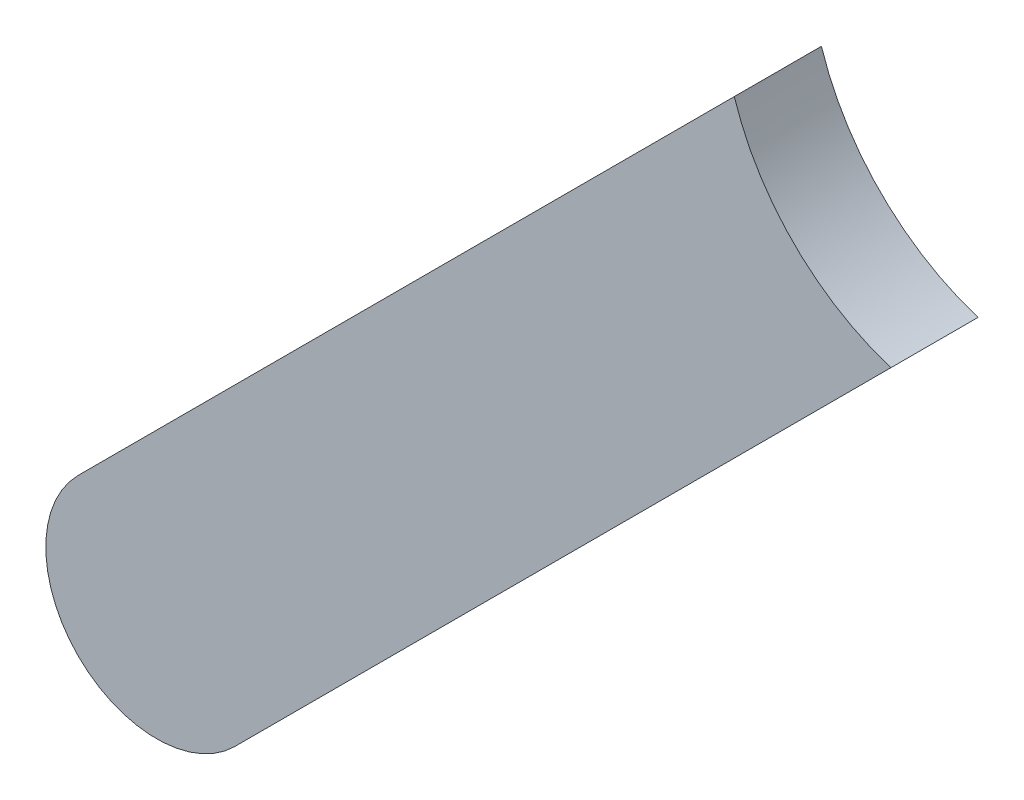
ISO-10303-21;
HEADER;
FILE_DESCRIPTION(('STEP AP214'),'2;1');
FILE_NAME('part.step','',(''),(''),'','','');
FILE_SCHEMA(('AUTOMOTIVE_DESIGN { 1 0 10303 214 1 1 1 1 }'));
ENDSEC;
DATA;
#1=APPLICATION_CONTEXT('core data for automotive mechanical design processes');
#2=APPLICATION_PROTOCOL_DEFINITION('international standard','automotive_design',2000,#1);
#3=PRODUCT_CONTEXT('',#1,'mechanical');
#4=PRODUCT('Part','Part','',(#3));
#5=PRODUCT_RELATED_PRODUCT_CATEGORY('part','',(#4));
#6=PRODUCT_DEFINITION_FORMATION('','',#4);
#7=PRODUCT_DEFINITION_CONTEXT('part definition',#1,'design');
#8=PRODUCT_DEFINITION('design','',#6,#7);
#9=PRODUCT_DEFINITION_SHAPE('','',#8);
#10=(LENGTH_UNIT() NAMED_UNIT(*) SI_UNIT(.MILLI.,.METRE.));
#11=(NAMED_UNIT(*) PLANE_ANGLE_UNIT() SI_UNIT($,.RADIAN.));
#12=(NAMED_UNIT(*) SI_UNIT($,.STERADIAN.) SOLID_ANGLE_UNIT());
#13=UNCERTAINTY_MEASURE_WITH_UNIT(LENGTH_MEASURE(1.E-05),#10,'distance_accuracy_value','');
#14=(GEOMETRIC_REPRESENTATION_CONTEXT(3) GLOBAL_UNCERTAINTY_ASSIGNED_CONTEXT((#13)) GLOBAL_UNIT_ASSIGNED_CONTEXT((#10,
#11,#12)) REPRESENTATION_CONTEXT('',''));
#15=CARTESIAN_POINT('',(0.,0.,0.));
#16=DIRECTION('',(0.,0.,1.));
#17=DIRECTION('',(1.,0.,0.));
#18=AXIS2_PLACEMENT_3D('',#15,#16,#17);
#19=CARTESIAN_POINT('',(107.41840594,86.35519686,0.));
#20=DIRECTION('',(-0.707106781186545,0.70710678118655,0.));
#21=DIRECTION('',(0.70710678118655,0.707106781186545,0.));
#22=AXIS2_PLACEMENT_3D('',#19,#20,#21);
#23=PLANE('',#22);
#24=DIRECTION('',(0.70710678118655,0.707106781186545,0.));
#25=VECTOR('',#24,1.);
#26=CARTESIAN_POINT('',(107.41840594,86.35519686,0.1999996));
#27=LINE('',#26,#25);
#28=CARTESIAN_POINT('',(107.41840594,86.35519686,0.1999996));
#29=VERTEX_POINT('',#28);
#30=CARTESIAN_POINT('',(108.923672858856,87.8604637788559,0.1999996));
#31=VERTEX_POINT('',#30);
#32=EDGE_CURVE('E11',#29,#31,#27,.T.);
#33=ORIENTED_EDGE('',*,*,#32,.F.);
#34=DIRECTION('',(0.,0.,1.));
#35=VECTOR('',#34,1.);
#36=CARTESIAN_POINT('',(107.41840594,86.35519686,0.));
#37=LINE('',#36,#35);
#38=CARTESIAN_POINT('',(107.41840594,86.35519686,0.));
#39=VERTEX_POINT('',#38);
#40=EDGE_CURVE('E24',#39,#29,#37,.T.);
#41=ORIENTED_EDGE('',*,*,#40,.F.);
#42=DIRECTION('',(0.70710678118655,0.707106781186545,0.));
#43=VECTOR('',#42,1.);
#44=CARTESIAN_POINT('',(107.41840594,86.35519686,0.));
#45=LINE('',#44,#43);
#46=CARTESIAN_POINT('',(108.923672858856,87.8604637788559,0.));
#47=VERTEX_POINT('',#46);
#48=EDGE_CURVE('E75',#39,#47,#45,.T.);
#49=ORIENTED_EDGE('',*,*,#48,.T.);
#50=DIRECTION('',(0.,0.,1.));
#51=VECTOR('',#50,1.);
#52=CARTESIAN_POINT('',(108.923672858856,87.8604637788559,0.));
#53=LINE('',#52,#51);
#54=EDGE_CURVE('E37',#47,#31,#53,.T.);
#55=ORIENTED_EDGE('',*,*,#54,.T.);
#56=EDGE_LOOP('',(#33,#41,#49,#55));
#57=FACE_BOUND('',#56,.T.);
#58=ADVANCED_FACE('F17',(#57),#23,.F.);
#59=CARTESIAN_POINT('',(109.093,88.3890028,0.));
#60=DIRECTION('',(0.,0.,-1.));
#61=DIRECTION('',(1.,0.,0.));
#62=AXIS2_PLACEMENT_3D('',#59,#60,#61);
#63=CYLINDRICAL_SURFACE('',#62,0.55500016);
#64=DIRECTION('',(0.,0.,1.));
#65=VECTOR('',#64,1.);
#66=CARTESIAN_POINT('',(108.564460978856,88.2196756588559,0.));
#67=LINE('',#66,#65);
#68=CARTESIAN_POINT('',(108.564460978856,88.2196756588559,0.));
#69=VERTEX_POINT('',#68);
#70=CARTESIAN_POINT('',(108.564460978856,88.2196756588559,0.1999996));
#71=VERTEX_POINT('',#70);
#72=EDGE_CURVE('E67',#69,#71,#67,.T.);
#73=ORIENTED_EDGE('',*,*,#72,.T.);
#74=CARTESIAN_POINT('',(109.093,88.3890028,0.1999996));
#75=DIRECTION('',(0.,0.,1.));
#76=DIRECTION('',(1.,0.,0.));
#77=AXIS2_PLACEMENT_3D('',#74,#75,#76);
#78=CIRCLE('',#77,0.55500016);
#79=EDGE_CURVE('E82',#71,#31,#78,.T.);
#80=ORIENTED_EDGE('',*,*,#79,.T.);
#81=ORIENTED_EDGE('',*,*,#54,.F.);
#82=CARTESIAN_POINT('',(109.093,88.3890028,0.));
#83=DIRECTION('',(0.,0.,1.));
#84=DIRECTION('',(1.,0.,0.));
#85=AXIS2_PLACEMENT_3D('',#82,#83,#84);
#86=CIRCLE('',#85,0.55500016);
#87=EDGE_CURVE('E80',#69,#47,#86,.T.);
#88=ORIENTED_EDGE('',*,*,#87,.F.);
#89=EDGE_LOOP('',(#73,#80,#81,#88));
#90=FACE_BOUND('',#89,.T.);
#91=ADVANCED_FACE('F88',(#90),#63,.F.);
#92=CARTESIAN_POINT('',(108.564460978856,88.2196756588559,0.));
#93=DIRECTION('',(0.707106781186548,-0.707106781186548,0.));
#94=DIRECTION('',(-0.707106781186548,-0.707106781186548,0.));
#95=AXIS2_PLACEMENT_3D('',#92,#93,#94);
#96=PLANE('',#95);
#97=DIRECTION('',(-0.707106781186548,-0.707106781186548,0.));
#98=VECTOR('',#97,1.);
#99=CARTESIAN_POINT('',(108.91339406,88.56860874,0.1999996));
#100=LINE('',#99,#98);
#101=CARTESIAN_POINT('',(107.05919406,86.71440874,0.1999996));
#102=VERTEX_POINT('',#101);
#103=EDGE_CURVE('E71',#71,#102,#100,.T.);
#104=ORIENTED_EDGE('',*,*,#103,.F.);
#105=ORIENTED_EDGE('',*,*,#72,.F.);
#106=DIRECTION('',(-0.707106781186548,-0.707106781186548,0.));
#107=VECTOR('',#106,1.);
#108=CARTESIAN_POINT('',(108.91339406,88.56860874,0.));
#109=LINE('',#108,#107);
#110=CARTESIAN_POINT('',(107.05919406,86.71440874,0.));
#111=VERTEX_POINT('',#110);
#112=EDGE_CURVE('E63',#69,#111,#109,.T.);
#113=ORIENTED_EDGE('',*,*,#112,.T.);
#114=DIRECTION('',(0.,0.,1.));
#115=VECTOR('',#114,1.);
#116=CARTESIAN_POINT('',(107.05919406,86.71440874,0.));
#117=LINE('',#116,#115);
#118=EDGE_CURVE('E53',#111,#102,#117,.T.);
#119=ORIENTED_EDGE('',*,*,#118,.T.);
#120=EDGE_LOOP('',(#104,#105,#113,#119));
#121=FACE_BOUND('',#120,.T.);
#122=ADVANCED_FACE('F66',(#121),#96,.F.);
#123=CARTESIAN_POINT('',(107.2388,86.5348028,0.));
#124=DIRECTION('',(0.,0.,-1.));
#125=DIRECTION('',(-0.707106781186548,0.707106781186548,0.));
#126=AXIS2_PLACEMENT_3D('',#123,#124,#125);
#127=CYLINDRICAL_SURFACE('',#126,0.254001156230764);
#128=CARTESIAN_POINT('',(107.2388,86.5348028,0.1999996));
#129=DIRECTION('',(0.,0.,1.));
#130=DIRECTION('',(-0.707106781186548,0.707106781186548,0.));
#131=AXIS2_PLACEMENT_3D('',#128,#129,#130);
#132=CIRCLE('',#131,0.254001156230764);
#133=EDGE_CURVE('E59',#102,#29,#132,.T.);
#134=ORIENTED_EDGE('',*,*,#133,.F.);
#135=ORIENTED_EDGE('',*,*,#118,.F.);
#136=CARTESIAN_POINT('',(107.2388,86.5348028,0.));
#137=DIRECTION('',(0.,0.,1.));
#138=DIRECTION('',(-0.707106781186548,0.707106781186548,0.));
#139=AXIS2_PLACEMENT_3D('',#136,#137,#138);
#140=CIRCLE('',#139,0.254001156230764);
#141=EDGE_CURVE('E57',#111,#39,#140,.T.);
#142=ORIENTED_EDGE('',*,*,#141,.T.);
#143=ORIENTED_EDGE('',*,*,#40,.T.);
#144=EDGE_LOOP('',(#134,#135,#142,#143));
#145=FACE_BOUND('',#144,.T.);
#146=ADVANCED_FACE('F55',(#145),#127,.T.);
#147=CARTESIAN_POINT('',(107.41840594,86.35519686,0.));
#148=DIRECTION('',(0.,0.,-1.));
#149=DIRECTION('',(-1.,0.,0.));
#150=AXIS2_PLACEMENT_3D('',#147,#148,#149);
#151=PLANE('',#150);
#152=ORIENTED_EDGE('',*,*,#48,.F.);
#153=ORIENTED_EDGE('',*,*,#141,.F.);
#154=ORIENTED_EDGE('',*,*,#112,.F.);
#155=ORIENTED_EDGE('',*,*,#87,.T.);
#156=EDGE_LOOP('',(#152,#153,#154,#155));
#157=FACE_BOUND('',#156,.T.);
#158=ADVANCED_FACE('F74',(#157),#151,.T.);
#159=CARTESIAN_POINT('',(107.41840594,86.35519686,0.1999996));
#160=DIRECTION('',(0.,0.,-1.));
#161=DIRECTION('',(-1.,0.,0.));
#162=AXIS2_PLACEMENT_3D('',#159,#160,#161);
#163=PLANE('',#162);
#164=ORIENTED_EDGE('',*,*,#133,.T.);
#165=ORIENTED_EDGE('',*,*,#32,.T.);
#166=ORIENTED_EDGE('',*,*,#79,.F.);
#167=ORIENTED_EDGE('',*,*,#103,.T.);
#168=EDGE_LOOP('',(#164,#165,#166,#167));
#169=FACE_BOUND('',#168,.T.);
#170=ADVANCED_FACE('F91',(#169),#163,.F.);
#171=CLOSED_SHELL('',(#58,#91,#122,#146,#158,#170));
#172=MANIFOLD_SOLID_BREP('B1',#171);
#173=ADVANCED_BREP_SHAPE_REPRESENTATION('',(#18,#172),#14);
#174=SHAPE_DEFINITION_REPRESENTATION(#9,#173);
ENDSEC;
END-ISO-10303-21;
